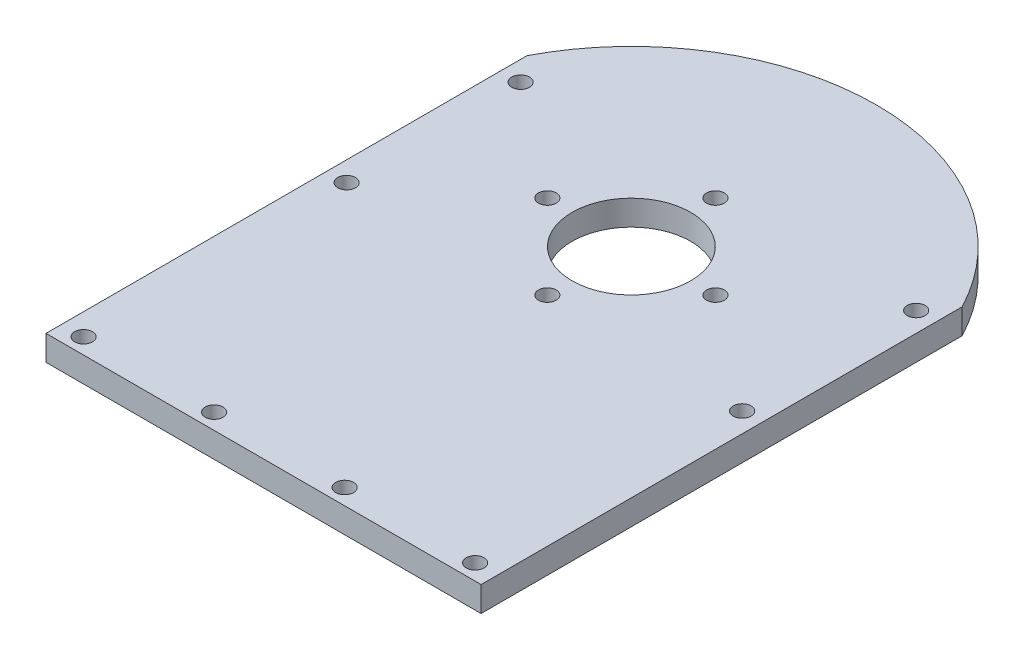
ISO-10303-21;
HEADER;
FILE_DESCRIPTION(('STEP AP214'),'2;1');
FILE_NAME('part.step','',(''),(''),'','','');
FILE_SCHEMA(('AUTOMOTIVE_DESIGN { 1 0 10303 214 1 1 1 1 }'));
ENDSEC;
DATA;
#1=APPLICATION_CONTEXT('core data for automotive mechanical design processes');
#2=APPLICATION_PROTOCOL_DEFINITION('international standard','automotive_design',2000,#1);
#3=PRODUCT_CONTEXT('',#1,'mechanical');
#4=PRODUCT('Part','Part','',(#3));
#5=PRODUCT_RELATED_PRODUCT_CATEGORY('part','',(#4));
#6=PRODUCT_DEFINITION_FORMATION('','',#4);
#7=PRODUCT_DEFINITION_CONTEXT('part definition',#1,'design');
#8=PRODUCT_DEFINITION('design','',#6,#7);
#9=PRODUCT_DEFINITION_SHAPE('','',#8);
#10=(LENGTH_UNIT() NAMED_UNIT(*) SI_UNIT(.MILLI.,.METRE.));
#11=(NAMED_UNIT(*) PLANE_ANGLE_UNIT() SI_UNIT($,.RADIAN.));
#12=(NAMED_UNIT(*) SI_UNIT($,.STERADIAN.) SOLID_ANGLE_UNIT());
#13=UNCERTAINTY_MEASURE_WITH_UNIT(LENGTH_MEASURE(1.E-05),#10,'distance_accuracy_value','');
#14=(GEOMETRIC_REPRESENTATION_CONTEXT(3) GLOBAL_UNCERTAINTY_ASSIGNED_CONTEXT((#13)) GLOBAL_UNIT_ASSIGNED_CONTEXT((#10,
#11,#12)) REPRESENTATION_CONTEXT('',''));
#15=CARTESIAN_POINT('',(0.,0.,0.));
#16=DIRECTION('',(0.,0.,1.));
#17=DIRECTION('',(1.,0.,0.));
#18=AXIS2_PLACEMENT_3D('',#15,#16,#17);
#19=CARTESIAN_POINT('',(0.,6.35,0.));
#20=DIRECTION('',(0.,1.,0.));
#21=DIRECTION('',(0.,0.,1.));
#22=AXIS2_PLACEMENT_3D('',#19,#20,#21);
#23=PLANE('',#22);
#24=CARTESIAN_POINT('',(66.5,6.35,67.));
#25=DIRECTION('',(0.,1.,0.));
#26=DIRECTION('',(0.,0.,1.));
#27=AXIS2_PLACEMENT_3D('',#24,#25,#26);
#28=CIRCLE('',#27,2.25000000000001);
#29=CARTESIAN_POINT('',(66.5,6.35,69.25));
#30=VERTEX_POINT('',#29);
#31=EDGE_CURVE('E190',#30,#30,#28,.T.);
#32=ORIENTED_EDGE('',*,*,#31,.F.);
#33=EDGE_LOOP('',(#32));
#34=FACE_BOUND('',#33,.T.);
#35=CARTESIAN_POINT('',(33.5,6.35,67.));
#36=DIRECTION('',(0.,1.,0.));
#37=DIRECTION('',(0.,0.,1.));
#38=AXIS2_PLACEMENT_3D('',#35,#36,#37);
#39=CIRCLE('',#38,2.25);
#40=CARTESIAN_POINT('',(33.5,6.35,69.25));
#41=VERTEX_POINT('',#40);
#42=EDGE_CURVE('E184',#41,#41,#39,.T.);
#43=ORIENTED_EDGE('',*,*,#42,.F.);
#44=EDGE_LOOP('',(#43));
#45=FACE_BOUND('',#44,.T.);
#46=CARTESIAN_POINT('',(0.499999999999987,6.35,67.));
#47=DIRECTION('',(0.,1.,0.));
#48=DIRECTION('',(0.,0.,1.));
#49=AXIS2_PLACEMENT_3D('',#46,#47,#48);
#50=CIRCLE('',#49,2.25);
#51=CARTESIAN_POINT('',(0.499999999999987,6.35,69.25));
#52=VERTEX_POINT('',#51);
#53=EDGE_CURVE('E178',#52,#52,#50,.T.);
#54=ORIENTED_EDGE('',*,*,#53,.F.);
#55=EDGE_LOOP('',(#54));
#56=FACE_BOUND('',#55,.T.);
#57=CARTESIAN_POINT('',(99.5,6.35,67.));
#58=DIRECTION('',(0.,1.,0.));
#59=DIRECTION('',(0.,0.,1.));
#60=AXIS2_PLACEMENT_3D('',#57,#58,#59);
#61=CIRCLE('',#60,2.25);
#62=CARTESIAN_POINT('',(99.5,6.35,69.25));
#63=VERTEX_POINT('',#62);
#64=EDGE_CURVE('E170',#63,#63,#61,.T.);
#65=ORIENTED_EDGE('',*,*,#64,.F.);
#66=EDGE_LOOP('',(#65));
#67=FACE_BOUND('',#66,.T.);
#68=CARTESIAN_POINT('',(50.,6.35,-21.9999999999997));
#69=DIRECTION('',(0.,-1.,0.));
#70=DIRECTION('',(0.,0.,1.));
#71=AXIS2_PLACEMENT_3D('',#68,#69,#70);
#72=CIRCLE('',#71,62.0000000000003);
#73=CARTESIAN_POINT('',(-5.00000000000001,6.35,-50.6181760425087));
#74=VERTEX_POINT('',#73);
#75=CARTESIAN_POINT('',(105.,6.35,-50.6181760425087));
#76=VERTEX_POINT('',#75);
#77=EDGE_CURVE('E167',#74,#76,#72,.T.);
#78=ORIENTED_EDGE('',*,*,#77,.F.);
#79=DIRECTION('',(0.,0.,1.));
#80=VECTOR('',#79,1.);
#81=CARTESIAN_POINT('',(-5.,6.35,16.));
#82=LINE('',#81,#80);
#83=CARTESIAN_POINT('',(-4.99999999999999,6.35,71.));
#84=VERTEX_POINT('',#83);
#85=EDGE_CURVE('E157',#74,#84,#82,.T.);
#86=ORIENTED_EDGE('',*,*,#85,.T.);
#87=DIRECTION('',(1.,0.,0.));
#88=VECTOR('',#87,1.);
#89=CARTESIAN_POINT('',(-4.99999999999999,6.35,71.));
#90=LINE('',#89,#88);
#91=CARTESIAN_POINT('',(105.,6.35,71.));
#92=VERTEX_POINT('',#91);
#93=EDGE_CURVE('E60',#84,#92,#90,.T.);
#94=ORIENTED_EDGE('',*,*,#93,.T.);
#95=DIRECTION('',(0.,0.,-1.));
#96=VECTOR('',#95,1.);
#97=CARTESIAN_POINT('',(105.,6.35,16.));
#98=LINE('',#97,#96);
#99=EDGE_CURVE('E92',#92,#76,#98,.T.);
#100=ORIENTED_EDGE('',*,*,#99,.T.);
#101=EDGE_LOOP('',(#78,#86,#94,#100));
#102=FACE_BOUND('',#101,.T.);
#103=CARTESIAN_POINT('',(50.,6.35,-21.9999999999997));
#104=DIRECTION('',(0.,1.,0.));
#105=DIRECTION('',(0.,0.,1.));
#106=AXIS2_PLACEMENT_3D('',#103,#104,#105);
#107=CIRCLE('',#106,15.);
#108=CARTESIAN_POINT('',(50.,6.35,-6.9999999999997));
#109=VERTEX_POINT('',#108);
#110=EDGE_CURVE('E100',#109,#109,#107,.T.);
#111=ORIENTED_EDGE('',*,*,#110,.F.);
#112=EDGE_LOOP('',(#111));
#113=FACE_BOUND('',#112,.T.);
#114=CARTESIAN_POINT('',(50.0000000000006,6.35,-0.750000000000001));
#115=DIRECTION('',(0.,1.,0.));
#116=DIRECTION('',(0.,0.,1.));
#117=AXIS2_PLACEMENT_3D('',#114,#115,#116);
#118=CIRCLE('',#117,2.25);
#119=CARTESIAN_POINT('',(50.0000000000006,6.35,1.5));
#120=VERTEX_POINT('',#119);
#121=EDGE_CURVE('E117',#120,#120,#118,.T.);
#122=ORIENTED_EDGE('',*,*,#121,.F.);
#123=EDGE_LOOP('',(#122));
#124=FACE_BOUND('',#123,.T.);
#125=CARTESIAN_POINT('',(50.,6.35,-43.25));
#126=DIRECTION('',(0.,1.,0.));
#127=DIRECTION('',(0.,0.,1.));
#128=AXIS2_PLACEMENT_3D('',#125,#126,#127);
#129=CIRCLE('',#128,2.25);
#130=CARTESIAN_POINT('',(50.,6.35,-41.));
#131=VERTEX_POINT('',#130);
#132=EDGE_CURVE('E129',#131,#131,#129,.T.);
#133=ORIENTED_EDGE('',*,*,#132,.F.);
#134=EDGE_LOOP('',(#133));
#135=FACE_BOUND('',#134,.T.);
#136=CARTESIAN_POINT('',(100.,6.35,-44.));
#137=DIRECTION('',(0.,1.,0.));
#138=DIRECTION('',(0.,0.,1.));
#139=AXIS2_PLACEMENT_3D('',#136,#137,#138);
#140=CIRCLE('',#139,2.25);
#141=CARTESIAN_POINT('',(100.,6.35,-41.75));
#142=VERTEX_POINT('',#141);
#143=EDGE_CURVE('E141',#142,#142,#140,.T.);
#144=ORIENTED_EDGE('',*,*,#143,.F.);
#145=EDGE_LOOP('',(#144));
#146=FACE_BOUND('',#145,.T.);
#147=CARTESIAN_POINT('',(0.,6.35,0.));
#148=DIRECTION('',(0.,1.,0.));
#149=DIRECTION('',(0.,0.,1.));
#150=AXIS2_PLACEMENT_3D('',#147,#148,#149);
#151=CIRCLE('',#150,2.25);
#152=CARTESIAN_POINT('',(0.,6.35,2.25));
#153=VERTEX_POINT('',#152);
#154=EDGE_CURVE('E89',#153,#153,#151,.T.);
#155=ORIENTED_EDGE('',*,*,#154,.F.);
#156=EDGE_LOOP('',(#155));
#157=FACE_BOUND('',#156,.T.);
#158=CARTESIAN_POINT('',(0.,6.35,-44.));
#159=DIRECTION('',(0.,1.,0.));
#160=DIRECTION('',(0.,0.,1.));
#161=AXIS2_PLACEMENT_3D('',#158,#159,#160);
#162=CIRCLE('',#161,2.25);
#163=CARTESIAN_POINT('',(0.,6.35,-41.75));
#164=VERTEX_POINT('',#163);
#165=EDGE_CURVE('E147',#164,#164,#162,.T.);
#166=ORIENTED_EDGE('',*,*,#165,.F.);
#167=EDGE_LOOP('',(#166));
#168=FACE_BOUND('',#167,.T.);
#169=CARTESIAN_POINT('',(100.,6.35,0.));
#170=DIRECTION('',(0.,1.,0.));
#171=DIRECTION('',(0.,0.,1.));
#172=AXIS2_PLACEMENT_3D('',#169,#170,#171);
#173=CIRCLE('',#172,2.25);
#174=CARTESIAN_POINT('',(100.,6.35,2.25));
#175=VERTEX_POINT('',#174);
#176=EDGE_CURVE('E135',#175,#175,#173,.T.);
#177=ORIENTED_EDGE('',*,*,#176,.F.);
#178=EDGE_LOOP('',(#177));
#179=FACE_BOUND('',#178,.T.);
#180=CARTESIAN_POINT('',(71.2500000000003,6.35,-22.0000000000003));
#181=DIRECTION('',(0.,1.,0.));
#182=DIRECTION('',(0.,0.,1.));
#183=AXIS2_PLACEMENT_3D('',#180,#181,#182);
#184=CIRCLE('',#183,2.25);
#185=CARTESIAN_POINT('',(71.2500000000003,6.35,-19.7500000000003));
#186=VERTEX_POINT('',#185);
#187=EDGE_CURVE('E123',#186,#186,#184,.T.);
#188=ORIENTED_EDGE('',*,*,#187,.F.);
#189=EDGE_LOOP('',(#188));
#190=FACE_BOUND('',#189,.T.);
#191=CARTESIAN_POINT('',(28.7500000000003,6.35,-21.9999999999997));
#192=DIRECTION('',(0.,1.,0.));
#193=DIRECTION('',(0.,0.,1.));
#194=AXIS2_PLACEMENT_3D('',#191,#192,#193);
#195=CIRCLE('',#194,2.25);
#196=CARTESIAN_POINT('',(28.7500000000003,6.35,-19.7499999999997));
#197=VERTEX_POINT('',#196);
#198=EDGE_CURVE('E104',#197,#197,#195,.T.);
#199=ORIENTED_EDGE('',*,*,#198,.F.);
#200=EDGE_LOOP('',(#199));
#201=FACE_BOUND('',#200,.T.);
#202=ADVANCED_FACE('F37',(#34,#45,#56,#67,#102,#113,#124,#135,#146,#157,#168,#179,#190,#201),
#23,.T.);
#203=CARTESIAN_POINT('',(0.,0.,0.));
#204=DIRECTION('',(0.,1.,0.));
#205=DIRECTION('',(0.,0.,1.));
#206=AXIS2_PLACEMENT_3D('',#203,#204,#205);
#207=PLANE('',#206);
#208=CARTESIAN_POINT('',(66.5,0.,67.));
#209=DIRECTION('',(0.,-1.,0.));
#210=DIRECTION('',(0.,0.,-1.));
#211=AXIS2_PLACEMENT_3D('',#208,#209,#210);
#212=CIRCLE('',#211,2.25000000000001);
#213=CARTESIAN_POINT('',(66.5,0.,64.75));
#214=VERTEX_POINT('',#213);
#215=EDGE_CURVE('E193',#214,#214,#212,.T.);
#216=ORIENTED_EDGE('',*,*,#215,.F.);
#217=EDGE_LOOP('',(#216));
#218=FACE_BOUND('',#217,.T.);
#219=CARTESIAN_POINT('',(33.5,0.,67.));
#220=DIRECTION('',(0.,-1.,0.));
#221=DIRECTION('',(0.,0.,-1.));
#222=AXIS2_PLACEMENT_3D('',#219,#220,#221);
#223=CIRCLE('',#222,2.25);
#224=CARTESIAN_POINT('',(33.5,0.,64.75));
#225=VERTEX_POINT('',#224);
#226=EDGE_CURVE('E187',#225,#225,#223,.T.);
#227=ORIENTED_EDGE('',*,*,#226,.F.);
#228=EDGE_LOOP('',(#227));
#229=FACE_BOUND('',#228,.T.);
#230=CARTESIAN_POINT('',(0.499999999999987,0.,67.));
#231=DIRECTION('',(0.,-1.,0.));
#232=DIRECTION('',(0.,0.,-1.));
#233=AXIS2_PLACEMENT_3D('',#230,#231,#232);
#234=CIRCLE('',#233,2.25);
#235=CARTESIAN_POINT('',(0.499999999999987,0.,64.75));
#236=VERTEX_POINT('',#235);
#237=EDGE_CURVE('E181',#236,#236,#234,.T.);
#238=ORIENTED_EDGE('',*,*,#237,.F.);
#239=EDGE_LOOP('',(#238));
#240=FACE_BOUND('',#239,.T.);
#241=CARTESIAN_POINT('',(99.5,0.,67.));
#242=DIRECTION('',(0.,-1.,0.));
#243=DIRECTION('',(0.,0.,-1.));
#244=AXIS2_PLACEMENT_3D('',#241,#242,#243);
#245=CIRCLE('',#244,2.25);
#246=CARTESIAN_POINT('',(99.5,0.,64.75));
#247=VERTEX_POINT('',#246);
#248=EDGE_CURVE('E173',#247,#247,#245,.T.);
#249=ORIENTED_EDGE('',*,*,#248,.F.);
#250=EDGE_LOOP('',(#249));
#251=FACE_BOUND('',#250,.T.);
#252=CARTESIAN_POINT('',(50.,0.,-21.9999999999997));
#253=DIRECTION('',(0.,1.,0.));
#254=DIRECTION('',(0.,0.,1.));
#255=AXIS2_PLACEMENT_3D('',#252,#253,#254);
#256=CIRCLE('',#255,15.);
#257=CARTESIAN_POINT('',(50.,0.,-6.9999999999997));
#258=VERTEX_POINT('',#257);
#259=EDGE_CURVE('E97',#258,#258,#256,.T.);
#260=ORIENTED_EDGE('',*,*,#259,.T.);
#261=EDGE_LOOP('',(#260));
#262=FACE_BOUND('',#261,.T.);
#263=CARTESIAN_POINT('',(50.0000000000006,0.,-0.750000000000001));
#264=DIRECTION('',(0.,1.,0.));
#265=DIRECTION('',(0.,0.,1.));
#266=AXIS2_PLACEMENT_3D('',#263,#264,#265);
#267=CIRCLE('',#266,2.25);
#268=CARTESIAN_POINT('',(50.0000000000006,0.,1.5));
#269=VERTEX_POINT('',#268);
#270=EDGE_CURVE('E115',#269,#269,#267,.T.);
#271=ORIENTED_EDGE('',*,*,#270,.T.);
#272=EDGE_LOOP('',(#271));
#273=FACE_BOUND('',#272,.T.);
#274=CARTESIAN_POINT('',(50.,0.,-43.25));
#275=DIRECTION('',(0.,1.,0.));
#276=DIRECTION('',(0.,0.,1.));
#277=AXIS2_PLACEMENT_3D('',#274,#275,#276);
#278=CIRCLE('',#277,2.25);
#279=CARTESIAN_POINT('',(50.,0.,-41.));
#280=VERTEX_POINT('',#279);
#281=EDGE_CURVE('E126',#280,#280,#278,.T.);
#282=ORIENTED_EDGE('',*,*,#281,.T.);
#283=EDGE_LOOP('',(#282));
#284=FACE_BOUND('',#283,.T.);
#285=CARTESIAN_POINT('',(100.,0.,-44.));
#286=DIRECTION('',(0.,1.,0.));
#287=DIRECTION('',(0.,0.,1.));
#288=AXIS2_PLACEMENT_3D('',#285,#286,#287);
#289=CIRCLE('',#288,2.25);
#290=CARTESIAN_POINT('',(100.,0.,-41.75));
#291=VERTEX_POINT('',#290);
#292=EDGE_CURVE('E138',#291,#291,#289,.T.);
#293=ORIENTED_EDGE('',*,*,#292,.T.);
#294=EDGE_LOOP('',(#293));
#295=FACE_BOUND('',#294,.T.);
#296=CARTESIAN_POINT('',(0.,0.,0.));
#297=DIRECTION('',(0.,1.,0.));
#298=DIRECTION('',(0.,0.,1.));
#299=AXIS2_PLACEMENT_3D('',#296,#297,#298);
#300=CIRCLE('',#299,2.25);
#301=CARTESIAN_POINT('',(0.,0.,2.25));
#302=VERTEX_POINT('',#301);
#303=EDGE_CURVE('E150',#302,#302,#300,.T.);
#304=ORIENTED_EDGE('',*,*,#303,.T.);
#305=EDGE_LOOP('',(#304));
#306=FACE_BOUND('',#305,.T.);
#307=DIRECTION('',(0.,0.,1.));
#308=VECTOR('',#307,1.);
#309=CARTESIAN_POINT('',(-5.,0.,16.));
#310=LINE('',#309,#308);
#311=CARTESIAN_POINT('',(-5.00000000000001,0.,-50.6181760425087));
#312=VERTEX_POINT('',#311);
#313=CARTESIAN_POINT('',(-4.99999999999999,0.,71.));
#314=VERTEX_POINT('',#313);
#315=EDGE_CURVE('E83',#312,#314,#310,.T.);
#316=ORIENTED_EDGE('',*,*,#315,.F.);
#317=CARTESIAN_POINT('',(50.,0.,-21.9999999999997));
#318=DIRECTION('',(0.,1.,0.));
#319=DIRECTION('',(0.,0.,1.));
#320=AXIS2_PLACEMENT_3D('',#317,#318,#319);
#321=CIRCLE('',#320,62.0000000000003);
#322=CARTESIAN_POINT('',(105.,0.,-50.6181760425087));
#323=VERTEX_POINT('',#322);
#324=EDGE_CURVE('E52',#312,#323,#321,.F.);
#325=ORIENTED_EDGE('',*,*,#324,.T.);
#326=DIRECTION('',(0.,0.,-1.));
#327=VECTOR('',#326,1.);
#328=CARTESIAN_POINT('',(105.,0.,16.));
#329=LINE('',#328,#327);
#330=CARTESIAN_POINT('',(105.,0.,71.));
#331=VERTEX_POINT('',#330);
#332=EDGE_CURVE('E73',#331,#323,#329,.T.);
#333=ORIENTED_EDGE('',*,*,#332,.F.);
#334=DIRECTION('',(1.,0.,0.));
#335=VECTOR('',#334,1.);
#336=CARTESIAN_POINT('',(-4.99999999999999,0.,71.));
#337=LINE('',#336,#335);
#338=EDGE_CURVE('E78',#314,#331,#337,.T.);
#339=ORIENTED_EDGE('',*,*,#338,.F.);
#340=EDGE_LOOP('',(#316,#325,#333,#339));
#341=FACE_BOUND('',#340,.T.);
#342=CARTESIAN_POINT('',(0.,0.,-44.));
#343=DIRECTION('',(0.,1.,0.));
#344=DIRECTION('',(0.,0.,1.));
#345=AXIS2_PLACEMENT_3D('',#342,#343,#344);
#346=CIRCLE('',#345,2.25);
#347=CARTESIAN_POINT('',(0.,0.,-41.75));
#348=VERTEX_POINT('',#347);
#349=EDGE_CURVE('E144',#348,#348,#346,.T.);
#350=ORIENTED_EDGE('',*,*,#349,.T.);
#351=EDGE_LOOP('',(#350));
#352=FACE_BOUND('',#351,.T.);
#353=CARTESIAN_POINT('',(100.,0.,0.));
#354=DIRECTION('',(0.,1.,0.));
#355=DIRECTION('',(0.,0.,1.));
#356=AXIS2_PLACEMENT_3D('',#353,#354,#355);
#357=CIRCLE('',#356,2.25);
#358=CARTESIAN_POINT('',(100.,0.,2.25));
#359=VERTEX_POINT('',#358);
#360=EDGE_CURVE('E132',#359,#359,#357,.T.);
#361=ORIENTED_EDGE('',*,*,#360,.T.);
#362=EDGE_LOOP('',(#361));
#363=FACE_BOUND('',#362,.T.);
#364=CARTESIAN_POINT('',(71.2500000000003,0.,-22.0000000000003));
#365=DIRECTION('',(0.,1.,0.));
#366=DIRECTION('',(0.,0.,1.));
#367=AXIS2_PLACEMENT_3D('',#364,#365,#366);
#368=CIRCLE('',#367,2.25);
#369=CARTESIAN_POINT('',(71.2500000000003,0.,-19.7500000000003));
#370=VERTEX_POINT('',#369);
#371=EDGE_CURVE('E120',#370,#370,#368,.T.);
#372=ORIENTED_EDGE('',*,*,#371,.T.);
#373=EDGE_LOOP('',(#372));
#374=FACE_BOUND('',#373,.T.);
#375=CARTESIAN_POINT('',(28.7500000000003,0.,-21.9999999999997));
#376=DIRECTION('',(0.,1.,0.));
#377=DIRECTION('',(0.,0.,1.));
#378=AXIS2_PLACEMENT_3D('',#375,#376,#377);
#379=CIRCLE('',#378,2.25);
#380=CARTESIAN_POINT('',(28.7500000000003,0.,-19.7499999999997));
#381=VERTEX_POINT('',#380);
#382=EDGE_CURVE('E99',#381,#381,#379,.T.);
#383=ORIENTED_EDGE('',*,*,#382,.T.);
#384=EDGE_LOOP('',(#383));
#385=FACE_BOUND('',#384,.T.);
#386=ADVANCED_FACE('F76',(#218,#229,#240,#251,#262,#273,#284,#295,#306,#341,#352,#363,#374,
#385),#207,.F.);
#387=CARTESIAN_POINT('',(-4.99999999999999,6.35,71.));
#388=DIRECTION('',(0.,0.,-1.));
#389=DIRECTION('',(-1.,0.,0.));
#390=AXIS2_PLACEMENT_3D('',#387,#388,#389);
#391=PLANE('',#390);
#392=ORIENTED_EDGE('',*,*,#338,.T.);
#393=DIRECTION('',(0.,-1.,0.));
#394=VECTOR('',#393,1.);
#395=CARTESIAN_POINT('',(105.,6.35,71.));
#396=LINE('',#395,#394);
#397=EDGE_CURVE('E86',#92,#331,#396,.T.);
#398=ORIENTED_EDGE('',*,*,#397,.F.);
#399=ORIENTED_EDGE('',*,*,#93,.F.);
#400=DIRECTION('',(0.,-1.,0.));
#401=VECTOR('',#400,1.);
#402=CARTESIAN_POINT('',(-4.99999999999999,6.35,71.));
#403=LINE('',#402,#401);
#404=EDGE_CURVE('E45',#84,#314,#403,.T.);
#405=ORIENTED_EDGE('',*,*,#404,.T.);
#406=EDGE_LOOP('',(#392,#398,#399,#405));
#407=FACE_BOUND('',#406,.T.);
#408=ADVANCED_FACE('F39',(#407),#391,.F.);
#409=CARTESIAN_POINT('',(105.,6.35,16.));
#410=DIRECTION('',(-1.,0.,0.));
#411=DIRECTION('',(0.,0.,1.));
#412=AXIS2_PLACEMENT_3D('',#409,#410,#411);
#413=PLANE('',#412);
#414=ORIENTED_EDGE('',*,*,#332,.T.);
#415=DIRECTION('',(0.,1.,0.));
#416=VECTOR('',#415,1.);
#417=CARTESIAN_POINT('',(105.,-53.65,-50.6181760425087));
#418=LINE('',#417,#416);
#419=EDGE_CURVE('E110',#323,#76,#418,.T.);
#420=ORIENTED_EDGE('',*,*,#419,.T.);
#421=ORIENTED_EDGE('',*,*,#99,.F.);
#422=ORIENTED_EDGE('',*,*,#397,.T.);
#423=EDGE_LOOP('',(#414,#420,#421,#422));
#424=FACE_BOUND('',#423,.T.);
#425=ADVANCED_FACE('F91',(#424),#413,.F.);
#426=CARTESIAN_POINT('',(-5.,6.35,16.));
#427=DIRECTION('',(1.,0.,0.));
#428=DIRECTION('',(0.,0.,-1.));
#429=AXIS2_PLACEMENT_3D('',#426,#427,#428);
#430=PLANE('',#429);
#431=ORIENTED_EDGE('',*,*,#85,.F.);
#432=DIRECTION('',(0.,1.,0.));
#433=VECTOR('',#432,1.);
#434=CARTESIAN_POINT('',(-5.00000000000001,-53.65,-50.6181760425087));
#435=LINE('',#434,#433);
#436=EDGE_CURVE('E11',#74,#312,#435,.F.);
#437=ORIENTED_EDGE('',*,*,#436,.T.);
#438=ORIENTED_EDGE('',*,*,#315,.T.);
#439=ORIENTED_EDGE('',*,*,#404,.F.);
#440=EDGE_LOOP('',(#431,#437,#438,#439));
#441=FACE_BOUND('',#440,.T.);
#442=ADVANCED_FACE('F162',(#441),#430,.F.);
#443=CARTESIAN_POINT('',(0.,6.35,0.));
#444=DIRECTION('',(0.,-1.,0.));
#445=DIRECTION('',(0.,0.,-1.));
#446=AXIS2_PLACEMENT_3D('',#443,#444,#445);
#447=CYLINDRICAL_SURFACE('',#446,2.25);
#448=ORIENTED_EDGE('',*,*,#154,.T.);
#449=EDGE_LOOP('',(#448));
#450=FACE_BOUND('',#449,.T.);
#451=ORIENTED_EDGE('',*,*,#303,.F.);
#452=EDGE_LOOP('',(#451));
#453=FACE_BOUND('',#452,.T.);
#454=ADVANCED_FACE('F216',(#450,#453),#447,.F.);
#455=CARTESIAN_POINT('',(0.,6.35,-44.));
#456=DIRECTION('',(0.,-1.,0.));
#457=DIRECTION('',(0.,0.,-1.));
#458=AXIS2_PLACEMENT_3D('',#455,#456,#457);
#459=CYLINDRICAL_SURFACE('',#458,2.25);
#460=ORIENTED_EDGE('',*,*,#165,.T.);
#461=EDGE_LOOP('',(#460));
#462=FACE_BOUND('',#461,.T.);
#463=ORIENTED_EDGE('',*,*,#349,.F.);
#464=EDGE_LOOP('',(#463));
#465=FACE_BOUND('',#464,.T.);
#466=ADVANCED_FACE('F218',(#462,#465),#459,.F.);
#467=CARTESIAN_POINT('',(100.,6.35,-44.));
#468=DIRECTION('',(0.,-1.,0.));
#469=DIRECTION('',(0.,0.,-1.));
#470=AXIS2_PLACEMENT_3D('',#467,#468,#469);
#471=CYLINDRICAL_SURFACE('',#470,2.25);
#472=ORIENTED_EDGE('',*,*,#143,.T.);
#473=EDGE_LOOP('',(#472));
#474=FACE_BOUND('',#473,.T.);
#475=ORIENTED_EDGE('',*,*,#292,.F.);
#476=EDGE_LOOP('',(#475));
#477=FACE_BOUND('',#476,.T.);
#478=ADVANCED_FACE('F225',(#474,#477),#471,.F.);
#479=CARTESIAN_POINT('',(100.,6.35,0.));
#480=DIRECTION('',(0.,-1.,0.));
#481=DIRECTION('',(0.,0.,-1.));
#482=AXIS2_PLACEMENT_3D('',#479,#480,#481);
#483=CYLINDRICAL_SURFACE('',#482,2.25);
#484=ORIENTED_EDGE('',*,*,#176,.T.);
#485=EDGE_LOOP('',(#484));
#486=FACE_BOUND('',#485,.T.);
#487=ORIENTED_EDGE('',*,*,#360,.F.);
#488=EDGE_LOOP('',(#487));
#489=FACE_BOUND('',#488,.T.);
#490=ADVANCED_FACE('F314',(#486,#489),#483,.F.);
#491=CARTESIAN_POINT('',(50.,6.35,-43.25));
#492=DIRECTION('',(0.,-1.,0.));
#493=DIRECTION('',(0.,0.,-1.));
#494=AXIS2_PLACEMENT_3D('',#491,#492,#493);
#495=CYLINDRICAL_SURFACE('',#494,2.25);
#496=ORIENTED_EDGE('',*,*,#132,.T.);
#497=EDGE_LOOP('',(#496));
#498=FACE_BOUND('',#497,.T.);
#499=ORIENTED_EDGE('',*,*,#281,.F.);
#500=EDGE_LOOP('',(#499));
#501=FACE_BOUND('',#500,.T.);
#502=ADVANCED_FACE('F310',(#498,#501),#495,.F.);
#503=CARTESIAN_POINT('',(71.2500000000003,6.35,-22.0000000000003));
#504=DIRECTION('',(0.,-1.,0.));
#505=DIRECTION('',(0.,0.,-1.));
#506=AXIS2_PLACEMENT_3D('',#503,#504,#505);
#507=CYLINDRICAL_SURFACE('',#506,2.25);
#508=ORIENTED_EDGE('',*,*,#187,.T.);
#509=EDGE_LOOP('',(#508));
#510=FACE_BOUND('',#509,.T.);
#511=ORIENTED_EDGE('',*,*,#371,.F.);
#512=EDGE_LOOP('',(#511));
#513=FACE_BOUND('',#512,.T.);
#514=ADVANCED_FACE('F306',(#510,#513),#507,.F.);
#515=CARTESIAN_POINT('',(50.0000000000006,6.35,-0.750000000000001));
#516=DIRECTION('',(0.,-1.,0.));
#517=DIRECTION('',(0.,0.,-1.));
#518=AXIS2_PLACEMENT_3D('',#515,#516,#517);
#519=CYLINDRICAL_SURFACE('',#518,2.25);
#520=ORIENTED_EDGE('',*,*,#121,.T.);
#521=EDGE_LOOP('',(#520));
#522=FACE_BOUND('',#521,.T.);
#523=ORIENTED_EDGE('',*,*,#270,.F.);
#524=EDGE_LOOP('',(#523));
#525=FACE_BOUND('',#524,.T.);
#526=ADVANCED_FACE('F302',(#522,#525),#519,.F.);
#527=CARTESIAN_POINT('',(28.7500000000003,6.35,-21.9999999999997));
#528=DIRECTION('',(0.,-1.,0.));
#529=DIRECTION('',(0.,0.,-1.));
#530=AXIS2_PLACEMENT_3D('',#527,#528,#529);
#531=CYLINDRICAL_SURFACE('',#530,2.25);
#532=ORIENTED_EDGE('',*,*,#198,.T.);
#533=EDGE_LOOP('',(#532));
#534=FACE_BOUND('',#533,.T.);
#535=ORIENTED_EDGE('',*,*,#382,.F.);
#536=EDGE_LOOP('',(#535));
#537=FACE_BOUND('',#536,.T.);
#538=ADVANCED_FACE('F299',(#534,#537),#531,.F.);
#539=CARTESIAN_POINT('',(50.,-3.65,-21.9999999999997));
#540=DIRECTION('',(0.,1.,0.));
#541=DIRECTION('',(0.,0.,1.));
#542=AXIS2_PLACEMENT_3D('',#539,#540,#541);
#543=CYLINDRICAL_SURFACE('',#542,15.);
#544=ORIENTED_EDGE('',*,*,#110,.T.);
#545=EDGE_LOOP('',(#544));
#546=FACE_BOUND('',#545,.T.);
#547=ORIENTED_EDGE('',*,*,#259,.F.);
#548=EDGE_LOOP('',(#547));
#549=FACE_BOUND('',#548,.T.);
#550=ADVANCED_FACE('F296',(#546,#549),#543,.F.);
#551=CARTESIAN_POINT('',(50.,-53.65,-21.9999999999997));
#552=DIRECTION('',(0.,1.,0.));
#553=DIRECTION('',(0.,0.,1.));
#554=AXIS2_PLACEMENT_3D('',#551,#552,#553);
#555=CYLINDRICAL_SURFACE('',#554,62.0000000000003);
#556=ORIENTED_EDGE('',*,*,#324,.F.);
#557=ORIENTED_EDGE('',*,*,#436,.F.);
#558=ORIENTED_EDGE('',*,*,#77,.T.);
#559=ORIENTED_EDGE('',*,*,#419,.F.);
#560=EDGE_LOOP('',(#556,#557,#558,#559));
#561=FACE_BOUND('',#560,.T.);
#562=ADVANCED_FACE('F165',(#561),#555,.T.);
#563=CARTESIAN_POINT('',(99.5,10.,67.));
#564=DIRECTION('',(0.,-1.,0.));
#565=DIRECTION('',(0.,0.,-1.));
#566=AXIS2_PLACEMENT_3D('',#563,#564,#565);
#567=CYLINDRICAL_SURFACE('',#566,2.25);
#568=ORIENTED_EDGE('',*,*,#64,.T.);
#569=EDGE_LOOP('',(#568));
#570=FACE_BOUND('',#569,.T.);
#571=ORIENTED_EDGE('',*,*,#248,.T.);
#572=EDGE_LOOP('',(#571));
#573=FACE_BOUND('',#572,.T.);
#574=ADVANCED_FACE('F254',(#570,#573),#567,.F.);
#575=CARTESIAN_POINT('',(0.499999999999987,10.,67.));
#576=DIRECTION('',(0.,-1.,0.));
#577=DIRECTION('',(0.,0.,-1.));
#578=AXIS2_PLACEMENT_3D('',#575,#576,#577);
#579=CYLINDRICAL_SURFACE('',#578,2.25);
#580=ORIENTED_EDGE('',*,*,#53,.T.);
#581=EDGE_LOOP('',(#580));
#582=FACE_BOUND('',#581,.T.);
#583=ORIENTED_EDGE('',*,*,#237,.T.);
#584=EDGE_LOOP('',(#583));
#585=FACE_BOUND('',#584,.T.);
#586=ADVANCED_FACE('F259',(#582,#585),#579,.F.);
#587=CARTESIAN_POINT('',(33.5,10.,67.));
#588=DIRECTION('',(0.,-1.,0.));
#589=DIRECTION('',(0.,0.,-1.));
#590=AXIS2_PLACEMENT_3D('',#587,#588,#589);
#591=CYLINDRICAL_SURFACE('',#590,2.25);
#592=ORIENTED_EDGE('',*,*,#42,.T.);
#593=EDGE_LOOP('',(#592));
#594=FACE_BOUND('',#593,.T.);
#595=ORIENTED_EDGE('',*,*,#226,.T.);
#596=EDGE_LOOP('',(#595));
#597=FACE_BOUND('',#596,.T.);
#598=ADVANCED_FACE('F271',(#594,#597),#591,.F.);
#599=CARTESIAN_POINT('',(66.5,10.,67.));
#600=DIRECTION('',(0.,-1.,0.));
#601=DIRECTION('',(0.,0.,-1.));
#602=AXIS2_PLACEMENT_3D('',#599,#600,#601);
#603=CYLINDRICAL_SURFACE('',#602,2.25000000000001);
#604=ORIENTED_EDGE('',*,*,#31,.T.);
#605=EDGE_LOOP('',(#604));
#606=FACE_BOUND('',#605,.T.);
#607=ORIENTED_EDGE('',*,*,#215,.T.);
#608=EDGE_LOOP('',(#607));
#609=FACE_BOUND('',#608,.T.);
#610=ADVANCED_FACE('F197',(#606,#609),#603,.F.);
#611=CLOSED_SHELL('',(#202,#386,#408,#425,#442,#454,#466,#478,#490,#502,#514,#526,#538,#550,
#562,#574,#586,#598,#610));
#612=MANIFOLD_SOLID_BREP('B2',#611);
#613=ADVANCED_BREP_SHAPE_REPRESENTATION('',(#18,#612),#14);
#614=SHAPE_DEFINITION_REPRESENTATION(#9,#613);
ENDSEC;
END-ISO-10303-21;
